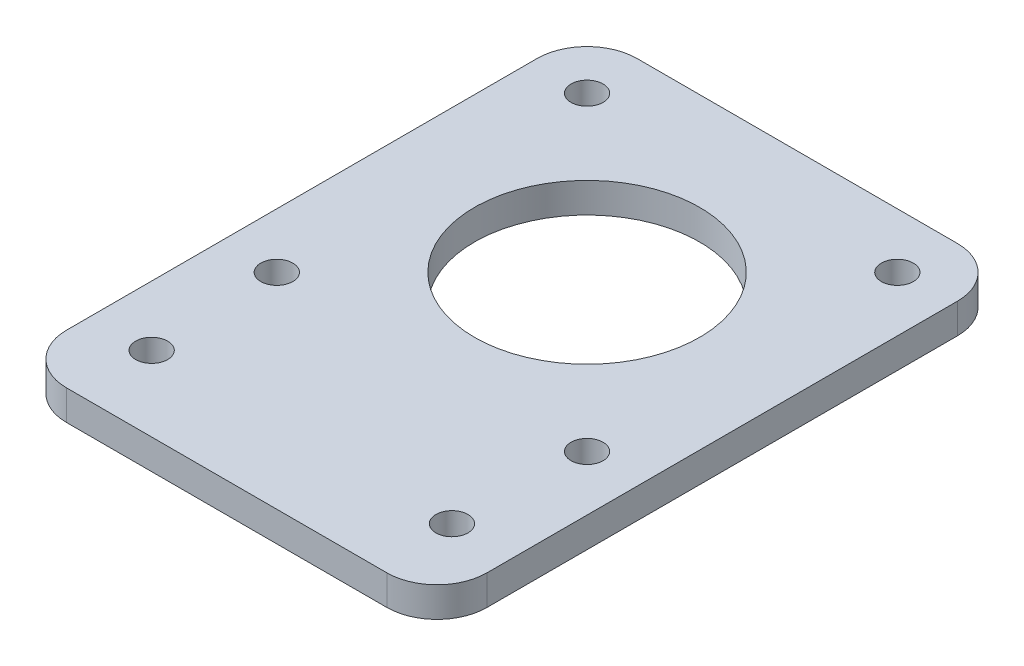
ISO-10303-21;
HEADER;
FILE_DESCRIPTION(('STEP AP214'),'2;1');
FILE_NAME('part.step','',(''),(''),'','','');
FILE_SCHEMA(('AUTOMOTIVE_DESIGN { 1 0 10303 214 1 1 1 1 }'));
ENDSEC;
DATA;
#1=APPLICATION_CONTEXT('core data for automotive mechanical design processes');
#2=APPLICATION_PROTOCOL_DEFINITION('international standard','automotive_design',2000,#1);
#3=PRODUCT_CONTEXT('',#1,'mechanical');
#4=PRODUCT('Part','Part','',(#3));
#5=PRODUCT_RELATED_PRODUCT_CATEGORY('part','',(#4));
#6=PRODUCT_DEFINITION_FORMATION('','',#4);
#7=PRODUCT_DEFINITION_CONTEXT('part definition',#1,'design');
#8=PRODUCT_DEFINITION('design','',#6,#7);
#9=PRODUCT_DEFINITION_SHAPE('','',#8);
#10=(LENGTH_UNIT() NAMED_UNIT(*) SI_UNIT(.MILLI.,.METRE.));
#11=(NAMED_UNIT(*) PLANE_ANGLE_UNIT() SI_UNIT($,.RADIAN.));
#12=(NAMED_UNIT(*) SI_UNIT($,.STERADIAN.) SOLID_ANGLE_UNIT());
#13=UNCERTAINTY_MEASURE_WITH_UNIT(LENGTH_MEASURE(1.E-05),#10,'distance_accuracy_value','');
#14=(GEOMETRIC_REPRESENTATION_CONTEXT(3) GLOBAL_UNCERTAINTY_ASSIGNED_CONTEXT((#13)) GLOBAL_UNIT_ASSIGNED_CONTEXT((#10,
#11,#12)) REPRESENTATION_CONTEXT('',''));
#15=CARTESIAN_POINT('',(0.,0.,0.));
#16=DIRECTION('',(0.,0.,1.));
#17=DIRECTION('',(1.,0.,0.));
#18=AXIS2_PLACEMENT_3D('',#15,#16,#17);
#19=CARTESIAN_POINT('',(0.,3.,0.));
#20=DIRECTION('',(0.,-1.,0.));
#21=DIRECTION('',(0.,0.,-1.));
#22=AXIS2_PLACEMENT_3D('',#19,#20,#21);
#23=PLANE('',#22);
#24=DIRECTION('',(-1.,0.,0.));
#25=VECTOR('',#24,1.);
#26=CARTESIAN_POINT('',(0.,3.,-57.));
#27=LINE('',#26,#25);
#28=CARTESIAN_POINT('',(37.,3.,-57.));
#29=VERTEX_POINT('',#28);
#30=CARTESIAN_POINT('',(5.,3.,-57.));
#31=VERTEX_POINT('',#30);
#32=EDGE_CURVE('E156',#29,#31,#27,.T.);
#33=ORIENTED_EDGE('',*,*,#32,.T.);
#34=CARTESIAN_POINT('',(5.,3.,-52.));
#35=DIRECTION('',(0.,-1.,0.));
#36=DIRECTION('',(0.,0.,-1.));
#37=AXIS2_PLACEMENT_3D('',#34,#35,#36);
#38=CIRCLE('',#37,5.);
#39=CARTESIAN_POINT('',(0.,3.,-52.));
#40=VERTEX_POINT('',#39);
#41=EDGE_CURVE('E185',#31,#40,#38,.F.);
#42=ORIENTED_EDGE('',*,*,#41,.T.);
#43=DIRECTION('',(0.,0.,1.));
#44=VECTOR('',#43,1.);
#45=CARTESIAN_POINT('',(0.,3.,0.));
#46=LINE('',#45,#44);
#47=CARTESIAN_POINT('',(0.,3.,-5.));
#48=VERTEX_POINT('',#47);
#49=EDGE_CURVE('E134',#40,#48,#46,.T.);
#50=ORIENTED_EDGE('',*,*,#49,.T.);
#51=CARTESIAN_POINT('',(5.,3.,-5.));
#52=DIRECTION('',(0.,-1.,0.));
#53=DIRECTION('',(0.,0.,-1.));
#54=AXIS2_PLACEMENT_3D('',#51,#52,#53);
#55=CIRCLE('',#54,5.);
#56=CARTESIAN_POINT('',(5.,3.,0.));
#57=VERTEX_POINT('',#56);
#58=EDGE_CURVE('E179',#48,#57,#55,.F.);
#59=ORIENTED_EDGE('',*,*,#58,.T.);
#60=DIRECTION('',(1.,0.,0.));
#61=VECTOR('',#60,1.);
#62=CARTESIAN_POINT('',(0.,3.,0.));
#63=LINE('',#62,#61);
#64=CARTESIAN_POINT('',(37.,3.,0.));
#65=VERTEX_POINT('',#64);
#66=EDGE_CURVE('E198',#57,#65,#63,.T.);
#67=ORIENTED_EDGE('',*,*,#66,.T.);
#68=CARTESIAN_POINT('',(37.,3.,-5.));
#69=DIRECTION('',(0.,-1.,0.));
#70=DIRECTION('',(0.,0.,-1.));
#71=AXIS2_PLACEMENT_3D('',#68,#69,#70);
#72=CIRCLE('',#71,5.);
#73=CARTESIAN_POINT('',(42.,3.,-5.));
#74=VERTEX_POINT('',#73);
#75=EDGE_CURVE('E68',#65,#74,#72,.F.);
#76=ORIENTED_EDGE('',*,*,#75,.T.);
#77=DIRECTION('',(0.,0.,-1.));
#78=VECTOR('',#77,1.);
#79=CARTESIAN_POINT('',(42.,3.,0.));
#80=LINE('',#79,#78);
#81=CARTESIAN_POINT('',(42.,3.,-52.));
#82=VERTEX_POINT('',#81);
#83=EDGE_CURVE('E205',#74,#82,#80,.T.);
#84=ORIENTED_EDGE('',*,*,#83,.T.);
#85=CARTESIAN_POINT('',(37.,3.,-52.));
#86=DIRECTION('',(0.,-1.,0.));
#87=DIRECTION('',(0.,0.,-1.));
#88=AXIS2_PLACEMENT_3D('',#85,#86,#87);
#89=CIRCLE('',#88,5.);
#90=EDGE_CURVE('E182',#82,#29,#89,.F.);
#91=ORIENTED_EDGE('',*,*,#90,.T.);
#92=EDGE_LOOP('',(#33,#42,#50,#59,#67,#76,#84,#91));
#93=FACE_BOUND('',#92,.T.);
#94=CARTESIAN_POINT('',(36.5,3.,-51.5));
#95=DIRECTION('',(0.,1.,0.));
#96=DIRECTION('',(0.,0.,1.));
#97=AXIS2_PLACEMENT_3D('',#94,#95,#96);
#98=CIRCLE('',#97,1.6);
#99=CARTESIAN_POINT('',(36.5,3.,-49.9));
#100=VERTEX_POINT('',#99);
#101=EDGE_CURVE('E145',#100,#100,#98,.T.);
#102=ORIENTED_EDGE('',*,*,#101,.F.);
#103=EDGE_LOOP('',(#102));
#104=FACE_BOUND('',#103,.T.);
#105=CARTESIAN_POINT('',(5.5,3.,-51.5));
#106=DIRECTION('',(0.,1.,0.));
#107=DIRECTION('',(0.,0.,1.));
#108=AXIS2_PLACEMENT_3D('',#105,#106,#107);
#109=CIRCLE('',#108,1.6);
#110=CARTESIAN_POINT('',(5.5,3.,-49.9));
#111=VERTEX_POINT('',#110);
#112=EDGE_CURVE('E224',#111,#111,#109,.T.);
#113=ORIENTED_EDGE('',*,*,#112,.F.);
#114=EDGE_LOOP('',(#113));
#115=FACE_BOUND('',#114,.T.);
#116=CARTESIAN_POINT('',(5.5,3.,-20.5));
#117=DIRECTION('',(0.,1.,0.));
#118=DIRECTION('',(0.,0.,1.));
#119=AXIS2_PLACEMENT_3D('',#116,#117,#118);
#120=CIRCLE('',#119,1.6);
#121=CARTESIAN_POINT('',(5.5,3.,-18.9));
#122=VERTEX_POINT('',#121);
#123=EDGE_CURVE('E230',#122,#122,#120,.T.);
#124=ORIENTED_EDGE('',*,*,#123,.F.);
#125=EDGE_LOOP('',(#124));
#126=FACE_BOUND('',#125,.T.);
#127=CARTESIAN_POINT('',(36.5,3.,-20.5));
#128=DIRECTION('',(0.,1.,0.));
#129=DIRECTION('',(0.,0.,1.));
#130=AXIS2_PLACEMENT_3D('',#127,#128,#129);
#131=CIRCLE('',#130,1.6);
#132=CARTESIAN_POINT('',(36.5,3.,-18.9));
#133=VERTEX_POINT('',#132);
#134=EDGE_CURVE('E238',#133,#133,#131,.T.);
#135=ORIENTED_EDGE('',*,*,#134,.F.);
#136=EDGE_LOOP('',(#135));
#137=FACE_BOUND('',#136,.T.);
#138=CARTESIAN_POINT('',(6.,3.,-7.49999999999999));
#139=DIRECTION('',(0.,1.,0.));
#140=DIRECTION('',(0.,0.,1.));
#141=AXIS2_PLACEMENT_3D('',#138,#139,#140);
#142=CIRCLE('',#141,1.6);
#143=CARTESIAN_POINT('',(6.,3.,-5.9));
#144=VERTEX_POINT('',#143);
#145=EDGE_CURVE('E246',#144,#144,#142,.T.);
#146=ORIENTED_EDGE('',*,*,#145,.F.);
#147=EDGE_LOOP('',(#146));
#148=FACE_BOUND('',#147,.T.);
#149=CARTESIAN_POINT('',(36.,3.,-7.49999999999999));
#150=DIRECTION('',(0.,1.,0.));
#151=DIRECTION('',(0.,0.,1.));
#152=AXIS2_PLACEMENT_3D('',#149,#150,#151);
#153=CIRCLE('',#152,1.6);
#154=CARTESIAN_POINT('',(36.,3.,-5.9));
#155=VERTEX_POINT('',#154);
#156=EDGE_CURVE('E254',#155,#155,#153,.T.);
#157=ORIENTED_EDGE('',*,*,#156,.F.);
#158=EDGE_LOOP('',(#157));
#159=FACE_BOUND('',#158,.T.);
#160=CARTESIAN_POINT('',(21.,3.,-36.));
#161=DIRECTION('',(0.,1.,0.));
#162=DIRECTION('',(0.,0.,1.));
#163=AXIS2_PLACEMENT_3D('',#160,#161,#162);
#164=CIRCLE('',#163,11.25);
#165=CARTESIAN_POINT('',(21.,3.,-24.75));
#166=VERTEX_POINT('',#165);
#167=EDGE_CURVE('E262',#166,#166,#164,.T.);
#168=ORIENTED_EDGE('',*,*,#167,.F.);
#169=EDGE_LOOP('',(#168));
#170=FACE_BOUND('',#169,.T.);
#171=ADVANCED_FACE('F45',(#93,#104,#115,#126,#137,#148,#159,#170),#23,.F.);
#172=CARTESIAN_POINT('',(0.,0.,0.));
#173=DIRECTION('',(0.,-1.,0.));
#174=DIRECTION('',(0.,0.,-1.));
#175=AXIS2_PLACEMENT_3D('',#172,#173,#174);
#176=PLANE('',#175);
#177=CARTESIAN_POINT('',(36.,0.,-7.49999999999999));
#178=DIRECTION('',(0.,1.,0.));
#179=DIRECTION('',(0.,0.,1.));
#180=AXIS2_PLACEMENT_3D('',#177,#178,#179);
#181=CIRCLE('',#180,1.6);
#182=CARTESIAN_POINT('',(36.,0.,-5.9));
#183=VERTEX_POINT('',#182);
#184=EDGE_CURVE('E258',#183,#183,#181,.T.);
#185=ORIENTED_EDGE('',*,*,#184,.T.);
#186=EDGE_LOOP('',(#185));
#187=FACE_BOUND('',#186,.T.);
#188=CARTESIAN_POINT('',(36.5,0.,-20.5));
#189=DIRECTION('',(0.,1.,0.));
#190=DIRECTION('',(0.,0.,1.));
#191=AXIS2_PLACEMENT_3D('',#188,#189,#190);
#192=CIRCLE('',#191,1.6);
#193=CARTESIAN_POINT('',(36.5,0.,-18.9));
#194=VERTEX_POINT('',#193);
#195=EDGE_CURVE('E242',#194,#194,#192,.T.);
#196=ORIENTED_EDGE('',*,*,#195,.T.);
#197=EDGE_LOOP('',(#196));
#198=FACE_BOUND('',#197,.T.);
#199=CARTESIAN_POINT('',(5.5,0.,-51.5));
#200=DIRECTION('',(0.,1.,0.));
#201=DIRECTION('',(0.,0.,1.));
#202=AXIS2_PLACEMENT_3D('',#199,#200,#201);
#203=CIRCLE('',#202,1.6);
#204=CARTESIAN_POINT('',(5.5,0.,-49.9));
#205=VERTEX_POINT('',#204);
#206=EDGE_CURVE('E226',#205,#205,#203,.T.);
#207=ORIENTED_EDGE('',*,*,#206,.T.);
#208=EDGE_LOOP('',(#207));
#209=FACE_BOUND('',#208,.T.);
#210=DIRECTION('',(0.,0.,1.));
#211=VECTOR('',#210,1.);
#212=CARTESIAN_POINT('',(0.,0.,0.));
#213=LINE('',#212,#211);
#214=CARTESIAN_POINT('',(0.,0.,-52.));
#215=VERTEX_POINT('',#214);
#216=CARTESIAN_POINT('',(0.,0.,-5.));
#217=VERTEX_POINT('',#216);
#218=EDGE_CURVE('E131',#215,#217,#213,.T.);
#219=ORIENTED_EDGE('',*,*,#218,.F.);
#220=CARTESIAN_POINT('',(5.,0.,-52.));
#221=DIRECTION('',(0.,-1.,0.));
#222=DIRECTION('',(0.,0.,-1.));
#223=AXIS2_PLACEMENT_3D('',#220,#221,#222);
#224=CIRCLE('',#223,5.);
#225=CARTESIAN_POINT('',(5.,0.,-57.));
#226=VERTEX_POINT('',#225);
#227=EDGE_CURVE('E113',#215,#226,#224,.T.);
#228=ORIENTED_EDGE('',*,*,#227,.T.);
#229=DIRECTION('',(-1.,0.,0.));
#230=VECTOR('',#229,1.);
#231=CARTESIAN_POINT('',(0.,0.,-57.));
#232=LINE('',#231,#230);
#233=CARTESIAN_POINT('',(37.,0.,-57.));
#234=VERTEX_POINT('',#233);
#235=EDGE_CURVE('E161',#234,#226,#232,.T.);
#236=ORIENTED_EDGE('',*,*,#235,.F.);
#237=CARTESIAN_POINT('',(37.,0.,-52.));
#238=DIRECTION('',(0.,-1.,0.));
#239=DIRECTION('',(0.,0.,-1.));
#240=AXIS2_PLACEMENT_3D('',#237,#238,#239);
#241=CIRCLE('',#240,5.);
#242=CARTESIAN_POINT('',(42.,0.,-52.));
#243=VERTEX_POINT('',#242);
#244=EDGE_CURVE('E125',#234,#243,#241,.T.);
#245=ORIENTED_EDGE('',*,*,#244,.T.);
#246=DIRECTION('',(0.,0.,-1.));
#247=VECTOR('',#246,1.);
#248=CARTESIAN_POINT('',(42.,0.,0.));
#249=LINE('',#248,#247);
#250=CARTESIAN_POINT('',(42.,0.,-5.));
#251=VERTEX_POINT('',#250);
#252=EDGE_CURVE('E150',#251,#243,#249,.T.);
#253=ORIENTED_EDGE('',*,*,#252,.F.);
#254=CARTESIAN_POINT('',(37.,0.,-5.));
#255=DIRECTION('',(0.,-1.,0.));
#256=DIRECTION('',(0.,0.,-1.));
#257=AXIS2_PLACEMENT_3D('',#254,#255,#256);
#258=CIRCLE('',#257,5.);
#259=CARTESIAN_POINT('',(37.,0.,0.));
#260=VERTEX_POINT('',#259);
#261=EDGE_CURVE('E136',#251,#260,#258,.T.);
#262=ORIENTED_EDGE('',*,*,#261,.T.);
#263=DIRECTION('',(1.,0.,0.));
#264=VECTOR('',#263,1.);
#265=CARTESIAN_POINT('',(0.,0.,0.));
#266=LINE('',#265,#264);
#267=CARTESIAN_POINT('',(5.,0.,0.));
#268=VERTEX_POINT('',#267);
#269=EDGE_CURVE('E144',#268,#260,#266,.T.);
#270=ORIENTED_EDGE('',*,*,#269,.F.);
#271=CARTESIAN_POINT('',(5.,0.,-5.));
#272=DIRECTION('',(0.,-1.,0.));
#273=DIRECTION('',(0.,0.,-1.));
#274=AXIS2_PLACEMENT_3D('',#271,#272,#273);
#275=CIRCLE('',#274,5.);
#276=EDGE_CURVE('E142',#268,#217,#275,.T.);
#277=ORIENTED_EDGE('',*,*,#276,.T.);
#278=EDGE_LOOP('',(#219,#228,#236,#245,#253,#262,#270,#277));
#279=FACE_BOUND('',#278,.T.);
#280=CARTESIAN_POINT('',(36.5,0.,-51.5));
#281=DIRECTION('',(0.,1.,0.));
#282=DIRECTION('',(0.,0.,1.));
#283=AXIS2_PLACEMENT_3D('',#280,#281,#282);
#284=CIRCLE('',#283,1.6);
#285=CARTESIAN_POINT('',(36.5,0.,-49.9));
#286=VERTEX_POINT('',#285);
#287=EDGE_CURVE('E153',#286,#286,#284,.T.);
#288=ORIENTED_EDGE('',*,*,#287,.T.);
#289=EDGE_LOOP('',(#288));
#290=FACE_BOUND('',#289,.T.);
#291=CARTESIAN_POINT('',(5.5,0.,-20.5));
#292=DIRECTION('',(0.,1.,0.));
#293=DIRECTION('',(0.,0.,1.));
#294=AXIS2_PLACEMENT_3D('',#291,#292,#293);
#295=CIRCLE('',#294,1.6);
#296=CARTESIAN_POINT('',(5.5,0.,-18.9));
#297=VERTEX_POINT('',#296);
#298=EDGE_CURVE('E234',#297,#297,#295,.T.);
#299=ORIENTED_EDGE('',*,*,#298,.T.);
#300=EDGE_LOOP('',(#299));
#301=FACE_BOUND('',#300,.T.);
#302=CARTESIAN_POINT('',(6.,0.,-7.49999999999999));
#303=DIRECTION('',(0.,1.,0.));
#304=DIRECTION('',(0.,0.,1.));
#305=AXIS2_PLACEMENT_3D('',#302,#303,#304);
#306=CIRCLE('',#305,1.6);
#307=CARTESIAN_POINT('',(6.,0.,-5.9));
#308=VERTEX_POINT('',#307);
#309=EDGE_CURVE('E250',#308,#308,#306,.T.);
#310=ORIENTED_EDGE('',*,*,#309,.T.);
#311=EDGE_LOOP('',(#310));
#312=FACE_BOUND('',#311,.T.);
#313=CARTESIAN_POINT('',(21.,0.,-36.));
#314=DIRECTION('',(0.,1.,0.));
#315=DIRECTION('',(0.,0.,1.));
#316=AXIS2_PLACEMENT_3D('',#313,#314,#315);
#317=CIRCLE('',#316,11.25);
#318=CARTESIAN_POINT('',(21.,0.,-24.75));
#319=VERTEX_POINT('',#318);
#320=EDGE_CURVE('E266',#319,#319,#317,.T.);
#321=ORIENTED_EDGE('',*,*,#320,.T.);
#322=EDGE_LOOP('',(#321));
#323=FACE_BOUND('',#322,.T.);
#324=ADVANCED_FACE('F139',(#187,#198,#209,#279,#290,#301,#312,#323),#176,.T.);
#325=CARTESIAN_POINT('',(0.,3.,0.));
#326=DIRECTION('',(1.,0.,0.));
#327=DIRECTION('',(0.,0.,-1.));
#328=AXIS2_PLACEMENT_3D('',#325,#326,#327);
#329=PLANE('',#328);
#330=ORIENTED_EDGE('',*,*,#49,.F.);
#331=DIRECTION('',(0.,-1.,0.));
#332=VECTOR('',#331,1.);
#333=CARTESIAN_POINT('',(0.,3.,-52.));
#334=LINE('',#333,#332);
#335=EDGE_CURVE('E117',#40,#215,#334,.T.);
#336=ORIENTED_EDGE('',*,*,#335,.T.);
#337=ORIENTED_EDGE('',*,*,#218,.T.);
#338=DIRECTION('',(0.,-1.,0.));
#339=VECTOR('',#338,1.);
#340=CARTESIAN_POINT('',(0.,3.,-5.));
#341=LINE('',#340,#339);
#342=EDGE_CURVE('E137',#217,#48,#341,.F.);
#343=ORIENTED_EDGE('',*,*,#342,.T.);
#344=EDGE_LOOP('',(#330,#336,#337,#343));
#345=FACE_BOUND('',#344,.T.);
#346=ADVANCED_FACE('F130',(#345),#329,.F.);
#347=CARTESIAN_POINT('',(0.,3.,0.));
#348=DIRECTION('',(0.,0.,-1.));
#349=DIRECTION('',(-1.,0.,0.));
#350=AXIS2_PLACEMENT_3D('',#347,#348,#349);
#351=PLANE('',#350);
#352=ORIENTED_EDGE('',*,*,#66,.F.);
#353=DIRECTION('',(0.,-1.,0.));
#354=VECTOR('',#353,1.);
#355=CARTESIAN_POINT('',(5.,3.,0.));
#356=LINE('',#355,#354);
#357=EDGE_CURVE('E11',#57,#268,#356,.T.);
#358=ORIENTED_EDGE('',*,*,#357,.T.);
#359=ORIENTED_EDGE('',*,*,#269,.T.);
#360=DIRECTION('',(0.,-1.,0.));
#361=VECTOR('',#360,1.);
#362=CARTESIAN_POINT('',(37.,3.,0.));
#363=LINE('',#362,#361);
#364=EDGE_CURVE('E54',#260,#65,#363,.F.);
#365=ORIENTED_EDGE('',*,*,#364,.T.);
#366=EDGE_LOOP('',(#352,#358,#359,#365));
#367=FACE_BOUND('',#366,.T.);
#368=ADVANCED_FACE('F197',(#367),#351,.F.);
#369=CARTESIAN_POINT('',(42.,3.,0.));
#370=DIRECTION('',(-1.,0.,0.));
#371=DIRECTION('',(0.,0.,1.));
#372=AXIS2_PLACEMENT_3D('',#369,#370,#371);
#373=PLANE('',#372);
#374=ORIENTED_EDGE('',*,*,#252,.T.);
#375=DIRECTION('',(0.,-1.,0.));
#376=VECTOR('',#375,1.);
#377=CARTESIAN_POINT('',(42.,3.,-52.));
#378=LINE('',#377,#376);
#379=EDGE_CURVE('E61',#243,#82,#378,.F.);
#380=ORIENTED_EDGE('',*,*,#379,.T.);
#381=ORIENTED_EDGE('',*,*,#83,.F.);
#382=DIRECTION('',(0.,-1.,0.));
#383=VECTOR('',#382,1.);
#384=CARTESIAN_POINT('',(42.,3.,-5.));
#385=LINE('',#384,#383);
#386=EDGE_CURVE('E188',#74,#251,#385,.T.);
#387=ORIENTED_EDGE('',*,*,#386,.T.);
#388=EDGE_LOOP('',(#374,#380,#381,#387));
#389=FACE_BOUND('',#388,.T.);
#390=ADVANCED_FACE('F209',(#389),#373,.F.);
#391=CARTESIAN_POINT('',(0.,3.,-57.));
#392=DIRECTION('',(0.,0.,1.));
#393=DIRECTION('',(1.,0.,0.));
#394=AXIS2_PLACEMENT_3D('',#391,#392,#393);
#395=PLANE('',#394);
#396=ORIENTED_EDGE('',*,*,#235,.T.);
#397=DIRECTION('',(0.,-1.,0.));
#398=VECTOR('',#397,1.);
#399=CARTESIAN_POINT('',(5.,3.,-57.));
#400=LINE('',#399,#398);
#401=EDGE_CURVE('E118',#226,#31,#400,.F.);
#402=ORIENTED_EDGE('',*,*,#401,.T.);
#403=ORIENTED_EDGE('',*,*,#32,.F.);
#404=DIRECTION('',(0.,-1.,0.));
#405=VECTOR('',#404,1.);
#406=CARTESIAN_POINT('',(37.,3.,-57.));
#407=LINE('',#406,#405);
#408=EDGE_CURVE('E124',#29,#234,#407,.T.);
#409=ORIENTED_EDGE('',*,*,#408,.T.);
#410=EDGE_LOOP('',(#396,#402,#403,#409));
#411=FACE_BOUND('',#410,.T.);
#412=ADVANCED_FACE('F216',(#411),#395,.F.);
#413=CARTESIAN_POINT('',(36.5,3.,-51.5));
#414=DIRECTION('',(0.,-1.,0.));
#415=DIRECTION('',(0.,0.,-1.));
#416=AXIS2_PLACEMENT_3D('',#413,#414,#415);
#417=CYLINDRICAL_SURFACE('',#416,1.6);
#418=ORIENTED_EDGE('',*,*,#101,.T.);
#419=EDGE_LOOP('',(#418));
#420=FACE_BOUND('',#419,.T.);
#421=ORIENTED_EDGE('',*,*,#287,.F.);
#422=EDGE_LOOP('',(#421));
#423=FACE_BOUND('',#422,.T.);
#424=ADVANCED_FACE('F286',(#420,#423),#417,.F.);
#425=CARTESIAN_POINT('',(5.5,3.,-51.5));
#426=DIRECTION('',(0.,-1.,0.));
#427=DIRECTION('',(0.,0.,-1.));
#428=AXIS2_PLACEMENT_3D('',#425,#426,#427);
#429=CYLINDRICAL_SURFACE('',#428,1.6);
#430=ORIENTED_EDGE('',*,*,#112,.T.);
#431=EDGE_LOOP('',(#430));
#432=FACE_BOUND('',#431,.T.);
#433=ORIENTED_EDGE('',*,*,#206,.F.);
#434=EDGE_LOOP('',(#433));
#435=FACE_BOUND('',#434,.T.);
#436=ADVANCED_FACE('F372',(#432,#435),#429,.F.);
#437=CARTESIAN_POINT('',(5.5,3.,-20.5));
#438=DIRECTION('',(0.,-1.,0.));
#439=DIRECTION('',(0.,0.,-1.));
#440=AXIS2_PLACEMENT_3D('',#437,#438,#439);
#441=CYLINDRICAL_SURFACE('',#440,1.6);
#442=ORIENTED_EDGE('',*,*,#123,.T.);
#443=EDGE_LOOP('',(#442));
#444=FACE_BOUND('',#443,.T.);
#445=ORIENTED_EDGE('',*,*,#298,.F.);
#446=EDGE_LOOP('',(#445));
#447=FACE_BOUND('',#446,.T.);
#448=ADVANCED_FACE('F362',(#444,#447),#441,.F.);
#449=CARTESIAN_POINT('',(36.5,3.,-20.5));
#450=DIRECTION('',(0.,-1.,0.));
#451=DIRECTION('',(0.,0.,-1.));
#452=AXIS2_PLACEMENT_3D('',#449,#450,#451);
#453=CYLINDRICAL_SURFACE('',#452,1.6);
#454=ORIENTED_EDGE('',*,*,#134,.T.);
#455=EDGE_LOOP('',(#454));
#456=FACE_BOUND('',#455,.T.);
#457=ORIENTED_EDGE('',*,*,#195,.F.);
#458=EDGE_LOOP('',(#457));
#459=FACE_BOUND('',#458,.T.);
#460=ADVANCED_FACE('F352',(#456,#459),#453,.F.);
#461=CARTESIAN_POINT('',(6.,3.,-7.49999999999999));
#462=DIRECTION('',(0.,-1.,0.));
#463=DIRECTION('',(0.,0.,-1.));
#464=AXIS2_PLACEMENT_3D('',#461,#462,#463);
#465=CYLINDRICAL_SURFACE('',#464,1.6);
#466=ORIENTED_EDGE('',*,*,#145,.T.);
#467=EDGE_LOOP('',(#466));
#468=FACE_BOUND('',#467,.T.);
#469=ORIENTED_EDGE('',*,*,#309,.F.);
#470=EDGE_LOOP('',(#469));
#471=FACE_BOUND('',#470,.T.);
#472=ADVANCED_FACE('F342',(#468,#471),#465,.F.);
#473=CARTESIAN_POINT('',(36.,3.,-7.49999999999999));
#474=DIRECTION('',(0.,-1.,0.));
#475=DIRECTION('',(0.,0.,-1.));
#476=AXIS2_PLACEMENT_3D('',#473,#474,#475);
#477=CYLINDRICAL_SURFACE('',#476,1.6);
#478=ORIENTED_EDGE('',*,*,#156,.T.);
#479=EDGE_LOOP('',(#478));
#480=FACE_BOUND('',#479,.T.);
#481=ORIENTED_EDGE('',*,*,#184,.F.);
#482=EDGE_LOOP('',(#481));
#483=FACE_BOUND('',#482,.T.);
#484=ADVANCED_FACE('F333',(#480,#483),#477,.F.);
#485=CARTESIAN_POINT('',(21.,3.,-36.));
#486=DIRECTION('',(0.,-1.,0.));
#487=DIRECTION('',(0.,0.,-1.));
#488=AXIS2_PLACEMENT_3D('',#485,#486,#487);
#489=CYLINDRICAL_SURFACE('',#488,11.25);
#490=ORIENTED_EDGE('',*,*,#167,.T.);
#491=EDGE_LOOP('',(#490));
#492=FACE_BOUND('',#491,.T.);
#493=ORIENTED_EDGE('',*,*,#320,.F.);
#494=EDGE_LOOP('',(#493));
#495=FACE_BOUND('',#494,.T.);
#496=ADVANCED_FACE('F274',(#492,#495),#489,.F.);
#497=CARTESIAN_POINT('',(5.,3.,-52.));
#498=DIRECTION('',(0.,-1.,0.));
#499=DIRECTION('',(0.,0.,-1.));
#500=AXIS2_PLACEMENT_3D('',#497,#498,#499);
#501=CYLINDRICAL_SURFACE('',#500,5.);
#502=ORIENTED_EDGE('',*,*,#41,.F.);
#503=ORIENTED_EDGE('',*,*,#401,.F.);
#504=ORIENTED_EDGE('',*,*,#227,.F.);
#505=ORIENTED_EDGE('',*,*,#335,.F.);
#506=EDGE_LOOP('',(#502,#503,#504,#505));
#507=FACE_BOUND('',#506,.T.);
#508=ADVANCED_FACE('F116',(#507),#501,.T.);
#509=CARTESIAN_POINT('',(37.,3.,-52.));
#510=DIRECTION('',(0.,-1.,0.));
#511=DIRECTION('',(0.,0.,-1.));
#512=AXIS2_PLACEMENT_3D('',#509,#510,#511);
#513=CYLINDRICAL_SURFACE('',#512,5.);
#514=ORIENTED_EDGE('',*,*,#90,.F.);
#515=ORIENTED_EDGE('',*,*,#379,.F.);
#516=ORIENTED_EDGE('',*,*,#244,.F.);
#517=ORIENTED_EDGE('',*,*,#408,.F.);
#518=EDGE_LOOP('',(#514,#515,#516,#517));
#519=FACE_BOUND('',#518,.T.);
#520=ADVANCED_FACE('F213',(#519),#513,.T.);
#521=CARTESIAN_POINT('',(5.,3.,-5.));
#522=DIRECTION('',(0.,-1.,0.));
#523=DIRECTION('',(0.,0.,-1.));
#524=AXIS2_PLACEMENT_3D('',#521,#522,#523);
#525=CYLINDRICAL_SURFACE('',#524,5.);
#526=ORIENTED_EDGE('',*,*,#58,.F.);
#527=ORIENTED_EDGE('',*,*,#342,.F.);
#528=ORIENTED_EDGE('',*,*,#276,.F.);
#529=ORIENTED_EDGE('',*,*,#357,.F.);
#530=EDGE_LOOP('',(#526,#527,#528,#529));
#531=FACE_BOUND('',#530,.T.);
#532=ADVANCED_FACE('F300',(#531),#525,.T.);
#533=CARTESIAN_POINT('',(37.,3.,-5.));
#534=DIRECTION('',(0.,-1.,0.));
#535=DIRECTION('',(0.,0.,-1.));
#536=AXIS2_PLACEMENT_3D('',#533,#534,#535);
#537=CYLINDRICAL_SURFACE('',#536,5.);
#538=ORIENTED_EDGE('',*,*,#75,.F.);
#539=ORIENTED_EDGE('',*,*,#364,.F.);
#540=ORIENTED_EDGE('',*,*,#261,.F.);
#541=ORIENTED_EDGE('',*,*,#386,.F.);
#542=EDGE_LOOP('',(#538,#539,#540,#541));
#543=FACE_BOUND('',#542,.T.);
#544=ADVANCED_FACE('F47',(#543),#537,.T.);
#545=CLOSED_SHELL('',(#171,#324,#346,#368,#390,#412,#424,#436,#448,#460,#472,#484,#496,#508,
#520,#532,#544));
#546=MANIFOLD_SOLID_BREP('B2',#545);
#547=ADVANCED_BREP_SHAPE_REPRESENTATION('',(#18,#546),#14);
#548=SHAPE_DEFINITION_REPRESENTATION(#9,#547);
ENDSEC;
END-ISO-10303-21;
